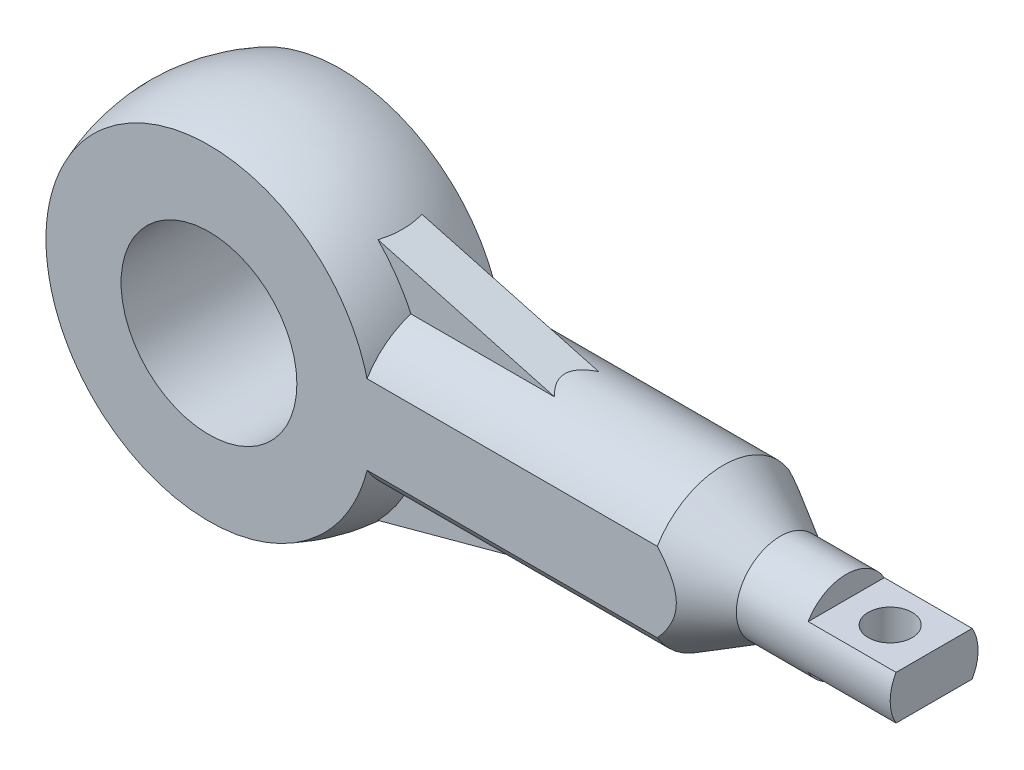
ISO-10303-21;
HEADER;
FILE_DESCRIPTION(('STEP AP214'),'2;1');
FILE_NAME('part.step','',(''),(''),'','','');
FILE_SCHEMA(('AUTOMOTIVE_DESIGN { 1 0 10303 214 1 1 1 1 }'));
ENDSEC;
DATA;
#1=APPLICATION_CONTEXT('core data for automotive mechanical design processes');
#2=APPLICATION_PROTOCOL_DEFINITION('international standard','automotive_design',2000,#1);
#3=PRODUCT_CONTEXT('',#1,'mechanical');
#4=PRODUCT('Part','Part','',(#3));
#5=PRODUCT_RELATED_PRODUCT_CATEGORY('part','',(#4));
#6=PRODUCT_DEFINITION_FORMATION('','',#4);
#7=PRODUCT_DEFINITION_CONTEXT('part definition',#1,'design');
#8=PRODUCT_DEFINITION('design','',#6,#7);
#9=PRODUCT_DEFINITION_SHAPE('','',#8);
#10=(LENGTH_UNIT() NAMED_UNIT(*) SI_UNIT(.MILLI.,.METRE.));
#11=(NAMED_UNIT(*) PLANE_ANGLE_UNIT() SI_UNIT($,.RADIAN.));
#12=(NAMED_UNIT(*) SI_UNIT($,.STERADIAN.) SOLID_ANGLE_UNIT());
#13=UNCERTAINTY_MEASURE_WITH_UNIT(LENGTH_MEASURE(1.E-05),#10,'distance_accuracy_value','');
#14=(GEOMETRIC_REPRESENTATION_CONTEXT(3) GLOBAL_UNCERTAINTY_ASSIGNED_CONTEXT((#13)) GLOBAL_UNIT_ASSIGNED_CONTEXT((#10,
#11,#12)) REPRESENTATION_CONTEXT('',''));
#15=CARTESIAN_POINT('',(0.,0.,0.));
#16=DIRECTION('',(0.,0.,1.));
#17=DIRECTION('',(1.,0.,0.));
#18=AXIS2_PLACEMENT_3D('',#15,#16,#17);
#19=CARTESIAN_POINT('',(150.,10.,0.));
#20=DIRECTION('',(-1.,0.,0.));
#21=DIRECTION('',(0.,0.,1.));
#22=AXIS2_PLACEMENT_3D('',#19,#20,#21);
#23=PLANE('',#22);
#24=DIRECTION('',(0.,0.,-1.));
#25=VECTOR('',#24,1.);
#26=CARTESIAN_POINT('',(150.,5.,15.001));
#27=LINE('',#26,#25);
#28=CARTESIAN_POINT('',(150.,5.,8.66025403784439));
#29=VERTEX_POINT('',#28);
#30=CARTESIAN_POINT('',(150.,5.,-8.66025403784439));
#31=VERTEX_POINT('',#30);
#32=EDGE_CURVE('E224',#29,#31,#27,.T.);
#33=ORIENTED_EDGE('',*,*,#32,.F.);
#34=CARTESIAN_POINT('',(150.,0.,0.));
#35=DIRECTION('',(-1.,0.,0.));
#36=DIRECTION('',(0.,0.,1.));
#37=AXIS2_PLACEMENT_3D('',#34,#35,#36);
#38=CIRCLE('',#37,10.);
#39=CARTESIAN_POINT('',(150.,-5.,8.66025403784439));
#40=VERTEX_POINT('',#39);
#41=EDGE_CURVE('E309',#40,#29,#38,.T.);
#42=ORIENTED_EDGE('',*,*,#41,.F.);
#43=DIRECTION('',(0.,0.,-1.));
#44=VECTOR('',#43,1.);
#45=CARTESIAN_POINT('',(150.,-5.,15.001));
#46=LINE('',#45,#44);
#47=CARTESIAN_POINT('',(150.,-5.,-8.66025403784439));
#48=VERTEX_POINT('',#47);
#49=EDGE_CURVE('E217',#40,#48,#46,.T.);
#50=ORIENTED_EDGE('',*,*,#49,.T.);
#51=EDGE_CURVE('E313',#31,#48,#38,.T.);
#52=ORIENTED_EDGE('',*,*,#51,.F.);
#53=EDGE_LOOP('',(#33,#42,#50,#52));
#54=FACE_BOUND('',#53,.T.);
#55=ADVANCED_FACE('F39',(#54),#23,.F.);
#56=CARTESIAN_POINT('',(0.,0.,0.));
#57=DIRECTION('',(-1.,0.,0.));
#58=DIRECTION('',(0.,0.,1.));
#59=AXIS2_PLACEMENT_3D('',#56,#57,#58);
#60=CYLINDRICAL_SURFACE('',#59,10.);
#61=CARTESIAN_POINT('',(115.,0.,0.));
#62=DIRECTION('',(-1.,0.,0.));
#63=DIRECTION('',(0.,0.,1.));
#64=AXIS2_PLACEMENT_3D('',#61,#62,#63);
#65=CIRCLE('',#64,10.);
#66=CARTESIAN_POINT('',(115.,0.,10.));
#67=VERTEX_POINT('',#66);
#68=EDGE_CURVE('E305',#67,#67,#65,.T.);
#69=ORIENTED_EDGE('',*,*,#68,.F.);
#70=EDGE_LOOP('',(#69));
#71=FACE_BOUND('',#70,.T.);
#72=CARTESIAN_POINT('',(130.,0.,0.));
#73=DIRECTION('',(1.,0.,0.));
#74=DIRECTION('',(0.,0.,-1.));
#75=AXIS2_PLACEMENT_3D('',#72,#73,#74);
#76=CIRCLE('',#75,10.);
#77=CARTESIAN_POINT('',(130.,5.,8.66025403784439));
#78=VERTEX_POINT('',#77);
#79=CARTESIAN_POINT('',(130.,5.,-8.66025403784439));
#80=VERTEX_POINT('',#79);
#81=EDGE_CURVE('E216',#78,#80,#76,.F.);
#82=ORIENTED_EDGE('',*,*,#81,.T.);
#83=DIRECTION('',(-1.,0.,0.));
#84=VECTOR('',#83,1.);
#85=CARTESIAN_POINT('',(0.,5.,-8.66025403784439));
#86=LINE('',#85,#84);
#87=EDGE_CURVE('E212',#31,#80,#86,.T.);
#88=ORIENTED_EDGE('',*,*,#87,.F.);
#89=ORIENTED_EDGE('',*,*,#51,.T.);
#90=DIRECTION('',(-1.,0.,0.));
#91=VECTOR('',#90,1.);
#92=CARTESIAN_POINT('',(0.,-5.,-8.66025403784439));
#93=LINE('',#92,#91);
#94=CARTESIAN_POINT('',(130.,-5.,-8.66025403784439));
#95=VERTEX_POINT('',#94);
#96=EDGE_CURVE('E208',#95,#48,#93,.F.);
#97=ORIENTED_EDGE('',*,*,#96,.F.);
#98=CARTESIAN_POINT('',(130.,0.,0.));
#99=DIRECTION('',(1.,0.,0.));
#100=DIRECTION('',(0.,0.,-1.));
#101=AXIS2_PLACEMENT_3D('',#98,#99,#100);
#102=CIRCLE('',#101,10.);
#103=CARTESIAN_POINT('',(130.,-5.,8.66025403784439));
#104=VERTEX_POINT('',#103);
#105=EDGE_CURVE('E234',#95,#104,#102,.F.);
#106=ORIENTED_EDGE('',*,*,#105,.T.);
#107=DIRECTION('',(-1.,0.,0.));
#108=VECTOR('',#107,1.);
#109=CARTESIAN_POINT('',(0.,-5.,8.66025403784439));
#110=LINE('',#109,#108);
#111=EDGE_CURVE('E237',#104,#40,#110,.F.);
#112=ORIENTED_EDGE('',*,*,#111,.T.);
#113=ORIENTED_EDGE('',*,*,#41,.T.);
#114=DIRECTION('',(-1.,0.,0.));
#115=VECTOR('',#114,1.);
#116=CARTESIAN_POINT('',(0.,5.,8.66025403784439));
#117=LINE('',#116,#115);
#118=EDGE_CURVE('E220',#29,#78,#117,.T.);
#119=ORIENTED_EDGE('',*,*,#118,.T.);
#120=EDGE_LOOP('',(#82,#88,#89,#97,#106,#112,#113,#119));
#121=FACE_BOUND('',#120,.T.);
#122=ADVANCED_FACE('F356',(#71,#121),#60,.T.);
#123=CARTESIAN_POINT('',(0.,0.,0.));
#124=DIRECTION('',(-1.,0.,0.));
#125=DIRECTION('',(0.,0.,1.));
#126=AXIS2_PLACEMENT_3D('',#123,#124,#125);
#127=CYLINDRICAL_SURFACE('',#126,17.5);
#128=CARTESIAN_POINT('',(102.009618943233,0.,0.));
#129=DIRECTION('',(-1.,0.,0.));
#130=DIRECTION('',(0.,0.,1.));
#131=AXIS2_PLACEMENT_3D('',#128,#129,#130);
#132=CIRCLE('',#131,17.5);
#133=CARTESIAN_POINT('',(102.009618943233,9.01387818865997,15.));
#134=VERTEX_POINT('',#133);
#135=CARTESIAN_POINT('',(102.009618943233,9.01387818865997,-15.));
#136=VERTEX_POINT('',#135);
#137=EDGE_CURVE('E302',#134,#136,#132,.T.);
#138=ORIENTED_EDGE('',*,*,#137,.T.);
#139=DIRECTION('',(-1.,0.,0.));
#140=VECTOR('',#139,1.);
#141=CARTESIAN_POINT('',(0.,9.01387818865997,-15.));
#142=LINE('',#141,#140);
#143=CARTESIAN_POINT('',(35.9687364248454,9.01387818865998,-15.));
#144=VERTEX_POINT('',#143);
#145=EDGE_CURVE('E11',#136,#144,#142,.T.);
#146=ORIENTED_EDGE('',*,*,#145,.T.);
#147=CARTESIAN_POINT('',(35.9687364248454,0.,0.));
#148=DIRECTION('',(-1.,0.,0.));
#149=DIRECTION('',(0.,0.,1.));
#150=AXIS2_PLACEMENT_3D('',#147,#148,#149);
#151=CIRCLE('',#150,17.5);
#152=CARTESIAN_POINT('',(35.9687364248454,16.7705098312484,-5.));
#153=VERTEX_POINT('',#152);
#154=EDGE_CURVE('E300',#153,#144,#151,.T.);
#155=ORIENTED_EDGE('',*,*,#154,.F.);
#156=DIRECTION('',(-1.,0.,0.));
#157=VECTOR('',#156,1.);
#158=CARTESIAN_POINT('',(0.,16.7705098312484,-5.));
#159=LINE('',#158,#157);
#160=CARTESIAN_POINT('',(68.6621134354366,16.7705098312484,-5.));
#161=VERTEX_POINT('',#160);
#162=EDGE_CURVE('E187',#161,#153,#159,.T.);
#163=ORIENTED_EDGE('',*,*,#162,.F.);
#164=CARTESIAN_POINT('',(130.581118749352,0.,0.));
#165=DIRECTION('',(-0.261426792553219,-0.965223306875324,0.));
#166=DIRECTION('',(-0.965223306875324,0.261426792553219,0.));
#167=AXIS2_PLACEMENT_3D('',#164,#165,#166);
#168=ELLIPSE('',#167,66.9403462020348,17.5);
#169=CARTESIAN_POINT('',(68.6621134354366,16.7705098312484,5.));
#170=VERTEX_POINT('',#169);
#171=EDGE_CURVE('E200',#161,#170,#168,.F.);
#172=ORIENTED_EDGE('',*,*,#171,.T.);
#173=DIRECTION('',(-1.,0.,0.));
#174=VECTOR('',#173,1.);
#175=CARTESIAN_POINT('',(0.,16.7705098312484,5.));
#176=LINE('',#175,#174);
#177=CARTESIAN_POINT('',(35.9687364248454,16.7705098312484,5.));
#178=VERTEX_POINT('',#177);
#179=EDGE_CURVE('E194',#170,#178,#176,.T.);
#180=ORIENTED_EDGE('',*,*,#179,.T.);
#181=CARTESIAN_POINT('',(35.9687364248454,9.01387818865997,15.));
#182=VERTEX_POINT('',#181);
#183=EDGE_CURVE('E295',#182,#178,#151,.T.);
#184=ORIENTED_EDGE('',*,*,#183,.F.);
#185=DIRECTION('',(-1.,0.,0.));
#186=VECTOR('',#185,1.);
#187=CARTESIAN_POINT('',(0.,9.01387818865997,15.));
#188=LINE('',#187,#186);
#189=EDGE_CURVE('E314',#182,#134,#188,.F.);
#190=ORIENTED_EDGE('',*,*,#189,.T.);
#191=EDGE_LOOP('',(#138,#146,#155,#163,#172,#180,#184,#190));
#192=FACE_BOUND('',#191,.T.);
#193=ADVANCED_FACE('F339',(#192),#127,.T.);
#194=CARTESIAN_POINT('',(0.,0.,0.));
#195=DIRECTION('',(-1.,0.,0.));
#196=DIRECTION('',(0.,1.,0.));
#197=AXIS2_PLACEMENT_3D('',#194,#195,#196);
#198=SPHERICAL_SURFACE('',#197,40.);
#199=CARTESIAN_POINT('',(8.92443178353758,-32.9502170529664,0.));
#200=DIRECTION('',(0.261426792553219,-0.965223306875324,0.));
#201=DIRECTION('',(0.965223306875324,0.261426792553219,0.));
#202=AXIS2_PLACEMENT_3D('',#199,#200,#201);
#203=CIRCLE('',#202,20.8479666515318);
#204=CARTESIAN_POINT('',(28.4600773263794,-27.6590672036587,-5.));
#205=VERTEX_POINT('',#204);
#206=CARTESIAN_POINT('',(28.4600773263794,-27.6590672036587,5.));
#207=VERTEX_POINT('',#206);
#208=EDGE_CURVE('E55',#205,#207,#203,.T.);
#209=ORIENTED_EDGE('',*,*,#208,.T.);
#210=CARTESIAN_POINT('',(0.,0.,5.));
#211=DIRECTION('',(0.,0.,1.));
#212=DIRECTION('',(1.,0.,0.));
#213=AXIS2_PLACEMENT_3D('',#210,#211,#212);
#214=CIRCLE('',#213,39.6862696659689);
#215=CARTESIAN_POINT('',(35.9687364248454,-16.7705098312484,5.));
#216=VERTEX_POINT('',#215);
#217=EDGE_CURVE('E152',#207,#216,#214,.T.);
#218=ORIENTED_EDGE('',*,*,#217,.T.);
#219=CARTESIAN_POINT('',(35.9687364248454,-9.01387818865998,15.));
#220=VERTEX_POINT('',#219);
#221=EDGE_CURVE('E294',#216,#220,#151,.T.);
#222=ORIENTED_EDGE('',*,*,#221,.T.);
#223=CARTESIAN_POINT('',(0.,0.,15.));
#224=DIRECTION('',(0.,0.,-1.));
#225=DIRECTION('',(-1.,0.,0.));
#226=AXIS2_PLACEMENT_3D('',#223,#224,#225);
#227=CIRCLE('',#226,37.0809924354783);
#228=EDGE_CURVE('E290',#220,#182,#227,.T.);
#229=ORIENTED_EDGE('',*,*,#228,.T.);
#230=ORIENTED_EDGE('',*,*,#183,.T.);
#231=CARTESIAN_POINT('',(0.,0.,5.));
#232=DIRECTION('',(0.,0.,1.));
#233=DIRECTION('',(1.,0.,0.));
#234=AXIS2_PLACEMENT_3D('',#231,#232,#233);
#235=CIRCLE('',#234,39.6862696659689);
#236=CARTESIAN_POINT('',(28.4600773263794,27.6590672036587,5.));
#237=VERTEX_POINT('',#236);
#238=EDGE_CURVE('E191',#178,#237,#235,.T.);
#239=ORIENTED_EDGE('',*,*,#238,.T.);
#240=CARTESIAN_POINT('',(8.92443178353758,32.9502170529664,0.));
#241=DIRECTION('',(-0.261426792553219,-0.965223306875324,0.));
#242=DIRECTION('',(0.965223306875324,-0.261426792553219,0.));
#243=AXIS2_PLACEMENT_3D('',#240,#241,#242);
#244=CIRCLE('',#243,20.8479666515318);
#245=CARTESIAN_POINT('',(28.4600773263794,27.6590672036587,-5.));
#246=VERTEX_POINT('',#245);
#247=EDGE_CURVE('E197',#237,#246,#244,.F.);
#248=ORIENTED_EDGE('',*,*,#247,.T.);
#249=CARTESIAN_POINT('',(0.,0.,-5.));
#250=DIRECTION('',(0.,0.,1.));
#251=DIRECTION('',(1.,0.,0.));
#252=AXIS2_PLACEMENT_3D('',#249,#250,#251);
#253=CIRCLE('',#252,39.6862696659689);
#254=EDGE_CURVE('E180',#153,#246,#253,.T.);
#255=ORIENTED_EDGE('',*,*,#254,.F.);
#256=ORIENTED_EDGE('',*,*,#154,.T.);
#257=CARTESIAN_POINT('',(0.,0.,-15.));
#258=DIRECTION('',(0.,0.,1.));
#259=DIRECTION('',(1.,0.,0.));
#260=AXIS2_PLACEMENT_3D('',#257,#258,#259);
#261=CIRCLE('',#260,37.0809924354783);
#262=CARTESIAN_POINT('',(35.9687364248454,-9.01387818865997,-15.));
#263=VERTEX_POINT('',#262);
#264=EDGE_CURVE('E264',#144,#263,#261,.T.);
#265=ORIENTED_EDGE('',*,*,#264,.T.);
#266=CARTESIAN_POINT('',(35.9687364248454,-16.7705098312484,-5.));
#267=VERTEX_POINT('',#266);
#268=EDGE_CURVE('E301',#263,#267,#151,.T.);
#269=ORIENTED_EDGE('',*,*,#268,.T.);
#270=CARTESIAN_POINT('',(0.,0.,-5.));
#271=DIRECTION('',(0.,0.,1.));
#272=DIRECTION('',(1.,0.,0.));
#273=AXIS2_PLACEMENT_3D('',#270,#271,#272);
#274=CIRCLE('',#273,39.6862696659689);
#275=EDGE_CURVE('E60',#205,#267,#274,.T.);
#276=ORIENTED_EDGE('',*,*,#275,.F.);
#277=EDGE_LOOP('',(#209,#218,#222,#229,#230,#239,#248,#255,#256,#265,#269,#276));
#278=FACE_BOUND('',#277,.T.);
#279=ADVANCED_FACE('F41',(#278),#198,.T.);
#280=CARTESIAN_POINT('',(115.,0.,0.));
#281=DIRECTION('',(-1.,0.,0.));
#282=DIRECTION('',(0.,0.,1.));
#283=AXIS2_PLACEMENT_3D('',#280,#281,#282);
#284=CONICAL_SURFACE('',#283,10.,0.523598775598299);
#285=CARTESIAN_POINT('',(64.6764576355632,-36.058829524109,-15.));
#286=CARTESIAN_POINT('',(65.682124961538,-35.4299390690583,-15.));
#287=CARTESIAN_POINT('',(66.6867341701834,-34.7993500219524,-15.));
#288=CARTESIAN_POINT('',(68.6933968407581,-33.5340884189301,-15.));
#289=CARTESIAN_POINT('',(69.6954502666173,-32.899415805822,-15.));
#290=CARTESIAN_POINT('',(71.697032877283,-31.6250004724211,-15.));
#291=CARTESIAN_POINT('',(72.6965605529674,-30.9852553801618,-15.));
#292=CARTESIAN_POINT('',(74.6919752984112,-29.7001193997222,-15.));
#293=CARTESIAN_POINT('',(75.6878623863205,-29.054728539743,-15.));
#294=CARTESIAN_POINT('',(77.6889287967543,-27.7482285840244,-15.));
#295=CARTESIAN_POINT('',(78.6940467947147,-27.0870254734471,-15.));
#296=CARTESIAN_POINT('',(80.6986640191708,-25.7561569201325,-15.));
#297=CARTESIAN_POINT('',(81.6981632791229,-25.0864915278607,-15.));
#298=CARTESIAN_POINT('',(83.6898556294696,-23.7368548740184,-15.));
#299=CARTESIAN_POINT('',(84.6820503334358,-23.0568859965688,-15.));
#300=CARTESIAN_POINT('',(86.6573210938738,-21.6838370953018,-15.));
#301=CARTESIAN_POINT('',(87.6403973866783,-20.9907574127156,-15.));
#302=CARTESIAN_POINT('',(89.1044651003762,-19.9395356282845,-15.));
#303=CARTESIAN_POINT('',(89.590009053093,-19.5877312944088,-15.));
#304=CARTESIAN_POINT('',(90.5575726907277,-18.8793128602188,-15.));
#305=CARTESIAN_POINT('',(91.0395924102056,-18.5226988071685,-15.));
#306=CARTESIAN_POINT('',(91.9996215965473,-17.8038484792425,-15.));
#307=CARTESIAN_POINT('',(92.4776299874748,-17.4416107658208,-15.));
#308=CARTESIAN_POINT('',(93.4287250790402,-16.7107286179595,-15.));
#309=CARTESIAN_POINT('',(93.9018118181284,-16.3420842336322,-15.));
#310=CARTESIAN_POINT('',(94.8401987396026,-15.5987937165396,-15.));
#311=CARTESIAN_POINT('',(95.3055224085255,-15.2241772878236,-15.));
#312=CARTESIAN_POINT('',(96.2290354156052,-14.4661929196328,-15.));
#313=CARTESIAN_POINT('',(96.6872244694631,-14.082824632909,-15.));
#314=CARTESIAN_POINT('',(97.5945512724964,-13.3058756585441,-15.));
#315=CARTESIAN_POINT('',(98.0436927266393,-12.9122993085885,-15.));
#316=CARTESIAN_POINT('',(98.9307799468095,-12.1127621719422,-15.));
#317=CARTESIAN_POINT('',(99.3687269992132,-11.7068028200789,-15.));
#318=CARTESIAN_POINT('',(100.112074553379,-10.9932592484842,-15.));
#319=CARTESIAN_POINT('',(100.420884583103,-10.6892314319921,-15.));
#320=CARTESIAN_POINT('',(101.029253919154,-10.0720066345793,-15.));
#321=CARTESIAN_POINT('',(101.32881298213,-9.75880941287364,-15.));
#322=CARTESIAN_POINT('',(101.917391662358,-9.12083467288816,-15.));
#323=CARTESIAN_POINT('',(102.206376101068,-8.79602455562942,-15.));
#324=CARTESIAN_POINT('',(102.76989513439,-8.13404520149835,-15.));
#325=CARTESIAN_POINT('',(103.04443004807,-7.79687623780824,-15.));
#326=CARTESIAN_POINT('',(103.578655184122,-7.10368708717479,-15.));
#327=CARTESIAN_POINT('',(103.838099315199,-6.74747577865695,-15.));
#328=CARTESIAN_POINT('',(104.332673594474,-6.01821224418128,-15.));
#329=CARTESIAN_POINT('',(104.567796043434,-5.64515473877516,-15.));
#330=CARTESIAN_POINT('',(105.005232901857,-4.88232077792489,-15.));
#331=CARTESIAN_POINT('',(105.207691504423,-4.49262797538464,-15.));
#332=CARTESIAN_POINT('',(105.57155655906,-3.69455845090558,-15.));
#333=CARTESIAN_POINT('',(105.733007122672,-3.28620236760122,-15.));
#334=CARTESIAN_POINT('',(105.948718258365,-2.62340629501984,-15.));
#335=CARTESIAN_POINT('',(106.019801026837,-2.37440360222564,-15.));
#336=CARTESIAN_POINT('',(106.141859388754,-1.87148768633617,-15.));
#337=CARTESIAN_POINT('',(106.192837835697,-1.61757516548577,-15.));
#338=CARTESIAN_POINT('',(106.272873937252,-1.106538588957,-15.));
#339=CARTESIAN_POINT('',(106.301952511518,-0.849417837254382,-15.));
#340=CARTESIAN_POINT('',(106.33715476653,-0.333590541251407,-15.));
#341=CARTESIAN_POINT('',(106.343278358275,-0.0748839908064155,-15.));
#342=CARTESIAN_POINT('',(106.332315118109,0.442377384005598,-15.));
#343=CARTESIAN_POINT('',(106.31519728075,0.700931544432368,-15.));
#344=CARTESIAN_POINT('',(106.258378304805,1.2155206532772,-15.));
#345=CARTESIAN_POINT('',(106.218677004026,1.47155558358883,-15.));
#346=CARTESIAN_POINT('',(106.118122080025,1.97958545982624,-15.));
#347=CARTESIAN_POINT('',(106.057253779467,2.23157747519804,-15.));
#348=CARTESIAN_POINT('',(105.916359233805,2.73012093555807,-15.));
#349=CARTESIAN_POINT('',(105.836330269147,2.97667160280228,-15.));
#350=CARTESIAN_POINT('',(105.613392909342,3.58989347460865,-15.));
#351=CARTESIAN_POINT('',(105.459399418976,3.95254559596395,-15.));
#352=CARTESIAN_POINT('',(105.119888287151,4.66276023148506,-15.));
#353=CARTESIAN_POINT('',(104.934350443417,5.01031289512388,-15.));
#354=CARTESIAN_POINT('',(104.537582675984,5.69214363828478,-15.));
#355=CARTESIAN_POINT('',(104.326254916434,6.02636435800243,-15.));
#356=CARTESIAN_POINT('',(103.994471985659,6.51747184585224,-15.));
#357=CARTESIAN_POINT('',(103.881428532679,6.67944947515229,-15.));
#358=CARTESIAN_POINT('',(103.650915387025,7.0002245473228,-15.));
#359=CARTESIAN_POINT('',(103.533445754208,7.159022033156,-15.));
#360=CARTESIAN_POINT('',(103.178854429021,7.62602309044351,-15.));
#361=CARTESIAN_POINT('',(102.936065179852,7.92993186812791,-15.));
#362=CARTESIAN_POINT('',(102.438204753792,8.52756092626357,-15.));
#363=CARTESIAN_POINT('',(102.18313066559,8.82127876296959,-15.));
#364=CARTESIAN_POINT('',(101.662787474502,9.39999033195982,-15.));
#365=CARTESIAN_POINT('',(101.397509411829,9.68497598330298,-15.));
#366=CARTESIAN_POINT('',(100.858770322552,10.2470362736412,-15.));
#367=CARTESIAN_POINT('',(100.585309914042,10.5241115071137,-15.));
#368=CARTESIAN_POINT('',(100.030606836286,11.0722875359114,-15.));
#369=CARTESIAN_POINT('',(99.7493405006461,11.3433643245137,-15.));
#370=CARTESIAN_POINT('',(99.1810310854785,11.8793889516971,-15.));
#371=CARTESIAN_POINT('',(98.8939879144494,12.1443366930553,-15.));
#372=CARTESIAN_POINT('',(98.3151400032922,12.6686944993651,-15.));
#373=CARTESIAN_POINT('',(98.0233375574246,12.9281071010493,-15.));
#374=CARTESIAN_POINT('',(97.4355336693643,13.4421360804964,-15.));
#375=CARTESIAN_POINT('',(97.1395321218576,13.696752337592,-15.));
#376=CARTESIAN_POINT('',(96.2387473801894,14.4604639017932,-15.));
#377=CARTESIAN_POINT('',(95.6283692499135,14.9629661693304,-15.));
#378=CARTESIAN_POINT('',(94.3963863358104,15.9540536352016,-15.));
#379=CARTESIAN_POINT('',(93.7747805178952,16.4426375408418,-15.));
#380=CARTESIAN_POINT('',(92.5241542930287,17.4074324277444,-15.));
#381=CARTESIAN_POINT('',(91.8951523621908,17.883667406226,-15.));
#382=CARTESIAN_POINT('',(90.6302010586126,18.8268309365509,-15.));
#383=CARTESIAN_POINT('',(89.9942515217081,19.2937592677489,-15.));
#384=CARTESIAN_POINT('',(88.8463960846147,20.1258341635171,-15.));
#385=CARTESIAN_POINT('',(88.3355171108849,20.4924001617977,-15.));
#386=CARTESIAN_POINT('',(87.3106862535526,21.2212135351825,-15.));
#387=CARTESIAN_POINT('',(86.7967343537147,21.583460887439,-15.));
#388=CARTESIAN_POINT('',(85.2508937783847,22.6645559245218,-15.));
#389=CARTESIAN_POINT('',(84.2150429823232,23.3777401738577,-15.));
#390=CARTESIAN_POINT('',(82.1344149299577,24.7928954857448,-15.));
#391=CARTESIAN_POINT('',(81.0896306875603,25.4948562458313,-15.));
#392=CARTESIAN_POINT('',(78.9937519253787,26.8892976279201,-15.));
#393=CARTESIAN_POINT('',(77.9426573660436,27.5817781904143,-15.));
#394=CARTESIAN_POINT('',(75.8780388583375,28.9311815156158,-15.));
#395=CARTESIAN_POINT('',(74.8647143549297,29.5884098233483,-15.));
#396=CARTESIAN_POINT('',(72.8342568315677,30.896965490565,-15.));
#397=CARTESIAN_POINT('',(71.8171237902929,31.5482928169452,-15.));
#398=CARTESIAN_POINT('',(69.7809062812839,32.8452276199072,-15.));
#399=CARTESIAN_POINT('',(68.7618255308859,33.4908409374627,-15.));
#400=CARTESIAN_POINT('',(66.7210134666199,34.7778310527241,-15.));
#401=CARTESIAN_POINT('',(65.6992821935066,35.4192079150385,-15.));
#402=CARTESIAN_POINT('',(64.6764576355632,36.0588295241089,-15.));
#403=B_SPLINE_CURVE_WITH_KNOTS('',3,(#285,#286,#287,#288,#289,#290,#291,#292,#293,#294,#295,
#296,#297,#298,#299,#300,#301,#302,#303,#304,#305,#306,#307,#308,#309,#310,#311,#312,#313,#314,
#315,#316,#317,#318,#319,#320,#321,#322,#323,#324,#325,#326,#327,#328,#329,#330,#331,#332,#333,
#334,#335,#336,#337,#338,#339,#340,#341,#342,#343,#344,#345,#346,#347,#348,#349,#350,#351,#352,
#353,#354,#355,#356,#357,#358,#359,#360,#361,#362,#363,#364,#365,#366,#367,#368,#369,#370,#371,
#372,#373,#374,#375,#376,#377,#378,#379,#380,#381,#382,#383,#384,#385,#386,#387,#388,#389,#390,
#391,#392,#393,#394,#395,#396,#397,#398,#399,#400,#401,#402),.UNSPECIFIED.,.F.,.F.,(4,2,2,2,2,2,
2,2,2,2,2,2,2,2,2,2,2,2,2,2,2,2,2,2,2,2,2,2,2,2,2,2,2,2,2,2,2,2,2,2,2,2,2,2,2,2,2,2,2,2,2,2,2,2,
2,2,2,2,4),(0.,3.55834997637371,7.11674989760774,10.6769254743079,14.2370832778343,
17.8463518158245,21.4555988397901,25.0640231013802,28.6723535763678,30.4711277035331,
32.2698841674333,34.06910859767,35.8683189609112,37.6603729741897,39.4524982151272,
41.2438740213107,43.0350430421069,44.3349502812289,45.6348916860603,46.9388238195963,
48.2427271481348,49.5639779494999,50.8856457324169,52.2013092287875,53.5155514404247,
54.2916944464156,55.0677272512139,55.8430178141993,56.6183113831743,57.3946402567567,
58.1709747059704,58.9478485475426,59.7248327195569,60.9047883159786,62.0855024699753,
63.270843754217,63.8633562714108,64.4558607785394,65.6223698274045,66.7891566937558,
67.9569925756661,69.1247404610275,70.2965314369959,71.4683409879335,72.6396014385814,
73.8108913167159,76.1824373472926,78.5542029262185,80.9209489920695,83.2877511029794,
85.1740757974404,87.0604104669855,90.8331639724604,94.6092019493785,98.3852636179667,
102.008633518969,105.63202373425,109.251139683917,112.870200311813),.UNSPECIFIED.);
#404=CARTESIAN_POINT('',(102.009618943233,-9.01387818865997,-15.));
#405=VERTEX_POINT('',#404);
#406=EDGE_CURVE('E254',#405,#136,#403,.T.);
#407=ORIENTED_EDGE('',*,*,#406,.T.);
#408=ORIENTED_EDGE('',*,*,#137,.F.);
#409=CARTESIAN_POINT('',(64.6764576355632,36.0588295241089,15.));
#410=CARTESIAN_POINT('',(65.682124961538,35.4299390690583,15.));
#411=CARTESIAN_POINT('',(66.6867341701834,34.7993500219524,15.));
#412=CARTESIAN_POINT('',(68.6933968407581,33.5340884189302,15.));
#413=CARTESIAN_POINT('',(69.6954502666172,32.899415805822,15.));
#414=CARTESIAN_POINT('',(71.697032877283,31.6250004724212,15.));
#415=CARTESIAN_POINT('',(72.6965605529673,30.9852553801618,15.));
#416=CARTESIAN_POINT('',(74.6919752984111,29.7001193997222,15.));
#417=CARTESIAN_POINT('',(75.6878623863204,29.054728539743,15.));
#418=CARTESIAN_POINT('',(77.6889287967542,27.7482285840245,15.));
#419=CARTESIAN_POINT('',(78.6940467947147,27.0870254734471,15.));
#420=CARTESIAN_POINT('',(80.6986640191707,25.7561569201325,15.));
#421=CARTESIAN_POINT('',(81.6981632791229,25.0864915278608,15.));
#422=CARTESIAN_POINT('',(83.6898556294695,23.7368548740184,15.));
#423=CARTESIAN_POINT('',(84.6820503334357,23.0568859965688,15.));
#424=CARTESIAN_POINT('',(86.6573210938737,21.6838370953018,15.));
#425=CARTESIAN_POINT('',(87.6403973866782,20.9907574127157,15.));
#426=CARTESIAN_POINT('',(89.1044651003761,19.9395356282846,15.));
#427=CARTESIAN_POINT('',(89.5900090530929,19.5877312944089,15.));
#428=CARTESIAN_POINT('',(90.5575726907276,18.8793128602189,15.));
#429=CARTESIAN_POINT('',(91.0395924102055,18.5226988071686,15.));
#430=CARTESIAN_POINT('',(91.9996215965472,17.8038484792426,15.));
#431=CARTESIAN_POINT('',(92.4776299874747,17.4416107658208,15.));
#432=CARTESIAN_POINT('',(93.4287250790401,16.7107286179596,15.));
#433=CARTESIAN_POINT('',(93.9018118181283,16.3420842336323,15.));
#434=CARTESIAN_POINT('',(94.8401987396025,15.5987937165397,15.));
#435=CARTESIAN_POINT('',(95.3055224085253,15.2241772878237,15.));
#436=CARTESIAN_POINT('',(96.229035415605,14.4661929196329,15.));
#437=CARTESIAN_POINT('',(96.6872244694629,14.0828246329092,15.));
#438=CARTESIAN_POINT('',(97.5945512724963,13.3058756585442,15.));
#439=CARTESIAN_POINT('',(98.0436927266392,12.9122993085886,15.));
#440=CARTESIAN_POINT('',(98.9307799468094,12.1127621719423,15.));
#441=CARTESIAN_POINT('',(99.3687269992131,11.706802820079,15.));
#442=CARTESIAN_POINT('',(100.112074553378,10.9932592484843,15.));
#443=CARTESIAN_POINT('',(100.420884583102,10.6892314319922,15.));
#444=CARTESIAN_POINT('',(101.029253919154,10.0720066345794,15.));
#445=CARTESIAN_POINT('',(101.32881298213,9.75880941287375,15.));
#446=CARTESIAN_POINT('',(101.917391662358,9.12083467288826,15.));
#447=CARTESIAN_POINT('',(102.206376101068,8.79602455562953,15.));
#448=CARTESIAN_POINT('',(102.76989513439,8.13404520149845,15.));
#449=CARTESIAN_POINT('',(103.04443004807,7.79687623780834,15.));
#450=CARTESIAN_POINT('',(103.578655184122,7.10368708717489,15.));
#451=CARTESIAN_POINT('',(103.838099315199,6.74747577865705,15.));
#452=CARTESIAN_POINT('',(104.332673594474,6.01821224418137,15.));
#453=CARTESIAN_POINT('',(104.567796043434,5.64515473877523,15.));
#454=CARTESIAN_POINT('',(105.005232901857,4.88232077792496,15.));
#455=CARTESIAN_POINT('',(105.207691504423,4.49262797538472,15.));
#456=CARTESIAN_POINT('',(105.57155655906,3.69455845090564,15.));
#457=CARTESIAN_POINT('',(105.733007122672,3.28620236760127,15.));
#458=CARTESIAN_POINT('',(105.948718258365,2.62340629501989,15.));
#459=CARTESIAN_POINT('',(106.019801026837,2.37440360222568,15.));
#460=CARTESIAN_POINT('',(106.141859388754,1.87148768633621,15.));
#461=CARTESIAN_POINT('',(106.192837835697,1.61757516548581,15.));
#462=CARTESIAN_POINT('',(106.272873937252,1.10653858895704,15.));
#463=CARTESIAN_POINT('',(106.301952511518,0.849417837254422,15.));
#464=CARTESIAN_POINT('',(106.33715476653,0.333590541251447,15.));
#465=CARTESIAN_POINT('',(106.343278358275,0.0748839908064569,15.));
#466=CARTESIAN_POINT('',(106.332315118109,-0.442377384005557,15.));
#467=CARTESIAN_POINT('',(106.31519728075,-0.700931544432327,15.));
#468=CARTESIAN_POINT('',(106.258378304805,-1.21552065327716,15.));
#469=CARTESIAN_POINT('',(106.218677004026,-1.47155558358878,15.));
#470=CARTESIAN_POINT('',(106.118122080025,-1.97958545982619,15.));
#471=CARTESIAN_POINT('',(106.057253779467,-2.231577475198,15.));
#472=CARTESIAN_POINT('',(105.916359233805,-2.73012093555804,15.));
#473=CARTESIAN_POINT('',(105.836330269147,-2.97667160280225,15.));
#474=CARTESIAN_POINT('',(105.613392909343,-3.58989347460861,15.));
#475=CARTESIAN_POINT('',(105.459399418976,-3.95254559596391,15.));
#476=CARTESIAN_POINT('',(105.119888287151,-4.66276023148501,15.));
#477=CARTESIAN_POINT('',(104.934350443417,-5.01031289512382,15.));
#478=CARTESIAN_POINT('',(104.537582675984,-5.69214363828472,15.));
#479=CARTESIAN_POINT('',(104.326254916434,-6.02636435800237,15.));
#480=CARTESIAN_POINT('',(103.994471985659,-6.51747184585218,15.));
#481=CARTESIAN_POINT('',(103.881428532679,-6.67944947515223,15.));
#482=CARTESIAN_POINT('',(103.650915387025,-7.00022454732274,15.));
#483=CARTESIAN_POINT('',(103.533445754208,-7.15902203315594,15.));
#484=CARTESIAN_POINT('',(103.178854429021,-7.62602309044346,15.));
#485=CARTESIAN_POINT('',(102.936065179852,-7.92993186812785,15.));
#486=CARTESIAN_POINT('',(102.438204753792,-8.5275609262635,15.));
#487=CARTESIAN_POINT('',(102.18313066559,-8.82127876296951,15.));
#488=CARTESIAN_POINT('',(101.662787474502,-9.39999033195973,15.));
#489=CARTESIAN_POINT('',(101.397509411829,-9.68497598330289,15.));
#490=CARTESIAN_POINT('',(100.858770322552,-10.2470362736411,15.));
#491=CARTESIAN_POINT('',(100.585309914042,-10.5241115071136,15.));
#492=CARTESIAN_POINT('',(100.030606836286,-11.0722875359113,15.));
#493=CARTESIAN_POINT('',(99.7493405006462,-11.3433643245136,15.));
#494=CARTESIAN_POINT('',(99.1810310854786,-11.879388951697,15.));
#495=CARTESIAN_POINT('',(98.8939879144495,-12.1443366930552,15.));
#496=CARTESIAN_POINT('',(98.3151400032924,-12.668694499365,15.));
#497=CARTESIAN_POINT('',(98.0233375574248,-12.9281071010492,15.));
#498=CARTESIAN_POINT('',(97.4355336693645,-13.4421360804962,15.));
#499=CARTESIAN_POINT('',(97.1395321218578,-13.6967523375919,15.));
#500=CARTESIAN_POINT('',(96.2387473801896,-14.460463901793,15.));
#501=CARTESIAN_POINT('',(95.6283692499137,-14.9629661693302,15.));
#502=CARTESIAN_POINT('',(94.3963863358107,-15.9540536352014,15.));
#503=CARTESIAN_POINT('',(93.7747805178955,-16.4426375408416,15.));
#504=CARTESIAN_POINT('',(92.524154293029,-17.4074324277443,15.));
#505=CARTESIAN_POINT('',(91.8951523621911,-17.8836674062258,15.));
#506=CARTESIAN_POINT('',(90.6302010586128,-18.8268309365507,15.));
#507=CARTESIAN_POINT('',(89.9942515217084,-19.2937592677487,15.));
#508=CARTESIAN_POINT('',(88.846396084615,-20.1258341635169,15.));
#509=CARTESIAN_POINT('',(88.3355171108851,-20.4924001617975,15.));
#510=CARTESIAN_POINT('',(87.3106862535529,-21.2212135351823,15.));
#511=CARTESIAN_POINT('',(86.796734353715,-21.5834608874388,15.));
#512=CARTESIAN_POINT('',(85.2508937783849,-22.6645559245216,15.));
#513=CARTESIAN_POINT('',(84.2150429823235,-23.3777401738575,15.));
#514=CARTESIAN_POINT('',(82.1344149299579,-24.7928954857446,15.));
#515=CARTESIAN_POINT('',(81.0896306875605,-25.4948562458312,15.));
#516=CARTESIAN_POINT('',(78.9937519253789,-26.88929762792,15.));
#517=CARTESIAN_POINT('',(77.9426573660437,-27.5817781904142,15.));
#518=CARTESIAN_POINT('',(75.8780388583376,-28.9311815156157,15.));
#519=CARTESIAN_POINT('',(74.8647143549299,-29.5884098233482,15.));
#520=CARTESIAN_POINT('',(72.8342568315678,-30.8969654905649,15.));
#521=CARTESIAN_POINT('',(71.817123790293,-31.5482928169451,15.));
#522=CARTESIAN_POINT('',(69.780906281284,-32.8452276199072,15.));
#523=CARTESIAN_POINT('',(68.761825530886,-33.4908409374627,15.));
#524=CARTESIAN_POINT('',(66.72101346662,-34.7778310527241,15.));
#525=CARTESIAN_POINT('',(65.6992821935066,-35.4192079150385,15.));
#526=CARTESIAN_POINT('',(64.6764576355632,-36.0588295241089,15.));
#527=B_SPLINE_CURVE_WITH_KNOTS('',3,(#409,#410,#411,#412,#413,#414,#415,#416,#417,#418,#419,
#420,#421,#422,#423,#424,#425,#426,#427,#428,#429,#430,#431,#432,#433,#434,#435,#436,#437,#438,
#439,#440,#441,#442,#443,#444,#445,#446,#447,#448,#449,#450,#451,#452,#453,#454,#455,#456,#457,
#458,#459,#460,#461,#462,#463,#464,#465,#466,#467,#468,#469,#470,#471,#472,#473,#474,#475,#476,
#477,#478,#479,#480,#481,#482,#483,#484,#485,#486,#487,#488,#489,#490,#491,#492,#493,#494,#495,
#496,#497,#498,#499,#500,#501,#502,#503,#504,#505,#506,#507,#508,#509,#510,#511,#512,#513,#514,
#515,#516,#517,#518,#519,#520,#521,#522,#523,#524,#525,#526),.UNSPECIFIED.,.F.,.F.,(4,2,2,2,2,2,
2,2,2,2,2,2,2,2,2,2,2,2,2,2,2,2,2,2,2,2,2,2,2,2,2,2,2,2,2,2,2,2,2,2,2,2,2,2,2,2,2,2,2,2,2,2,2,2,
2,2,2,2,4),(0.,3.5583499763737,7.11674989760771,10.6769254743078,14.2370832778343,
17.8463518158244,21.45559883979,25.0640231013801,28.6723535763677,30.4711277035329,
32.2698841674332,34.0691085976699,35.868318960911,37.6603729741895,39.452498215127,
41.2438740213105,43.0350430421067,44.3349502812287,45.6348916860602,46.9388238195961,
48.2427271481347,49.5639779494998,50.8856457324168,52.2013092287874,53.5155514404246,
54.2916944464155,55.0677272512139,55.8430178141993,56.6183113831743,57.3946402567566,
58.1709747059703,58.9478485475426,59.7248327195569,60.9047883159785,62.0855024699752,
63.2708437542169,63.8633562714107,64.4558607785393,65.6223698274043,66.7891566937557,
67.956992575666,69.1247404610273,70.2965314369957,71.4683409879333,72.6396014385811,
73.8108913167157,76.1824373472923,78.5542029262181,80.9209489920692,83.287751102979,
85.17407579744,87.0604104669851,90.8331639724601,94.6092019493782,98.3852636179665,
102.008633518969,105.632023734249,109.251139683917,112.870200311813),.UNSPECIFIED.);
#528=CARTESIAN_POINT('',(102.009618943233,-9.01387818865997,15.));
#529=VERTEX_POINT('',#528);
#530=EDGE_CURVE('E282',#134,#529,#527,.T.);
#531=ORIENTED_EDGE('',*,*,#530,.T.);
#532=EDGE_CURVE('E299',#405,#529,#132,.T.);
#533=ORIENTED_EDGE('',*,*,#532,.F.);
#534=EDGE_LOOP('',(#407,#408,#531,#533));
#535=FACE_BOUND('',#534,.T.);
#536=ORIENTED_EDGE('',*,*,#68,.T.);
#537=EDGE_LOOP('',(#536));
#538=FACE_BOUND('',#537,.T.);
#539=ADVANCED_FACE('F266',(#535,#538),#284,.T.);
#540=ORIENTED_EDGE('',*,*,#221,.F.);
#541=DIRECTION('',(-1.,0.,0.));
#542=VECTOR('',#541,1.);
#543=CARTESIAN_POINT('',(0.,-16.7705098312484,5.));
#544=LINE('',#543,#542);
#545=CARTESIAN_POINT('',(68.6621134354366,-16.7705098312484,5.));
#546=VERTEX_POINT('',#545);
#547=EDGE_CURVE('E146',#216,#546,#544,.F.);
#548=ORIENTED_EDGE('',*,*,#547,.T.);
#549=CARTESIAN_POINT('',(130.581118749352,0.,0.));
#550=DIRECTION('',(0.261426792553219,-0.965223306875324,0.));
#551=DIRECTION('',(-0.965223306875324,-0.261426792553219,0.));
#552=AXIS2_PLACEMENT_3D('',#549,#550,#551);
#553=ELLIPSE('',#552,66.9403462020348,17.5);
#554=CARTESIAN_POINT('',(68.6621134354366,-16.7705098312484,-5.));
#555=VERTEX_POINT('',#554);
#556=EDGE_CURVE('E139',#546,#555,#553,.T.);
#557=ORIENTED_EDGE('',*,*,#556,.T.);
#558=DIRECTION('',(-1.,0.,0.));
#559=VECTOR('',#558,1.);
#560=CARTESIAN_POINT('',(0.,-16.7705098312484,-5.));
#561=LINE('',#560,#559);
#562=EDGE_CURVE('E144',#267,#555,#561,.F.);
#563=ORIENTED_EDGE('',*,*,#562,.F.);
#564=ORIENTED_EDGE('',*,*,#268,.F.);
#565=DIRECTION('',(-1.,0.,0.));
#566=VECTOR('',#565,1.);
#567=CARTESIAN_POINT('',(0.,-9.01387818865997,-15.));
#568=LINE('',#567,#566);
#569=EDGE_CURVE('E48',#263,#405,#568,.F.);
#570=ORIENTED_EDGE('',*,*,#569,.T.);
#571=ORIENTED_EDGE('',*,*,#532,.T.);
#572=DIRECTION('',(-1.,0.,0.));
#573=VECTOR('',#572,1.);
#574=CARTESIAN_POINT('',(0.,-9.01387818865997,15.));
#575=LINE('',#574,#573);
#576=EDGE_CURVE('E318',#529,#220,#575,.T.);
#577=ORIENTED_EDGE('',*,*,#576,.T.);
#578=EDGE_LOOP('',(#540,#548,#557,#563,#564,#570,#571,#577));
#579=FACE_BOUND('',#578,.T.);
#580=ADVANCED_FACE('F142',(#579),#127,.T.);
#581=CARTESIAN_POINT('',(0.,0.,15.));
#582=DIRECTION('',(0.,0.,-1.));
#583=DIRECTION('',(-1.,0.,0.));
#584=AXIS2_PLACEMENT_3D('',#581,#582,#583);
#585=PLANE('',#584);
#586=CARTESIAN_POINT('',(0.,0.,15.));
#587=DIRECTION('',(0.,0.,1.));
#588=DIRECTION('',(1.,0.,0.));
#589=AXIS2_PLACEMENT_3D('',#586,#587,#588);
#590=CIRCLE('',#589,20.);
#591=CARTESIAN_POINT('',(20.,0.,15.));
#592=VERTEX_POINT('',#591);
#593=EDGE_CURVE('E231',#592,#592,#590,.T.);
#594=ORIENTED_EDGE('',*,*,#593,.F.);
#595=EDGE_LOOP('',(#594));
#596=FACE_BOUND('',#595,.T.);
#597=ORIENTED_EDGE('',*,*,#530,.F.);
#598=ORIENTED_EDGE('',*,*,#189,.F.);
#599=ORIENTED_EDGE('',*,*,#228,.F.);
#600=ORIENTED_EDGE('',*,*,#576,.F.);
#601=EDGE_LOOP('',(#597,#598,#599,#600));
#602=FACE_BOUND('',#601,.T.);
#603=ADVANCED_FACE('F276',(#596,#602),#585,.F.);
#604=CARTESIAN_POINT('',(0.,0.,-15.));
#605=DIRECTION('',(0.,0.,1.));
#606=DIRECTION('',(-1.,0.,0.));
#607=AXIS2_PLACEMENT_3D('',#604,#605,#606);
#608=PLANE('',#607);
#609=CARTESIAN_POINT('',(0.,0.,-15.));
#610=DIRECTION('',(0.,0.,1.));
#611=DIRECTION('',(1.,0.,0.));
#612=AXIS2_PLACEMENT_3D('',#609,#610,#611);
#613=CIRCLE('',#612,20.);
#614=CARTESIAN_POINT('',(20.,0.,-15.));
#615=VERTEX_POINT('',#614);
#616=EDGE_CURVE('E250',#615,#615,#613,.F.);
#617=ORIENTED_EDGE('',*,*,#616,.F.);
#618=EDGE_LOOP('',(#617));
#619=FACE_BOUND('',#618,.T.);
#620=ORIENTED_EDGE('',*,*,#406,.F.);
#621=ORIENTED_EDGE('',*,*,#569,.F.);
#622=ORIENTED_EDGE('',*,*,#264,.F.);
#623=ORIENTED_EDGE('',*,*,#145,.F.);
#624=EDGE_LOOP('',(#620,#621,#622,#623));
#625=FACE_BOUND('',#624,.T.);
#626=ADVANCED_FACE('F270',(#619,#625),#608,.F.);
#627=CARTESIAN_POINT('',(0.,0.,-15.001));
#628=DIRECTION('',(0.,0.,1.));
#629=DIRECTION('',(1.,0.,0.));
#630=AXIS2_PLACEMENT_3D('',#627,#628,#629);
#631=CYLINDRICAL_SURFACE('',#630,20.);
#632=ORIENTED_EDGE('',*,*,#593,.T.);
#633=EDGE_LOOP('',(#632));
#634=FACE_BOUND('',#633,.T.);
#635=ORIENTED_EDGE('',*,*,#616,.T.);
#636=EDGE_LOOP('',(#635));
#637=FACE_BOUND('',#636,.T.);
#638=ADVANCED_FACE('F275',(#634,#637),#631,.F.);
#639=CARTESIAN_POINT('',(130.,-10.,15.001));
#640=DIRECTION('',(1.,0.,0.));
#641=DIRECTION('',(0.,0.,-1.));
#642=AXIS2_PLACEMENT_3D('',#639,#640,#641);
#643=PLANE('',#642);
#644=DIRECTION('',(0.,0.,-1.));
#645=VECTOR('',#644,1.);
#646=CARTESIAN_POINT('',(130.,-5.,15.001));
#647=LINE('',#646,#645);
#648=EDGE_CURVE('E241',#104,#95,#647,.T.);
#649=ORIENTED_EDGE('',*,*,#648,.F.);
#650=ORIENTED_EDGE('',*,*,#105,.F.);
#651=EDGE_LOOP('',(#649,#650));
#652=FACE_BOUND('',#651,.T.);
#653=ADVANCED_FACE('F389',(#652),#643,.T.);
#654=CARTESIAN_POINT('',(130.,-5.,15.001));
#655=DIRECTION('',(0.,-1.,0.));
#656=DIRECTION('',(0.,0.,-1.));
#657=AXIS2_PLACEMENT_3D('',#654,#655,#656);
#658=PLANE('',#657);
#659=CARTESIAN_POINT('',(140.,-5.,0.));
#660=DIRECTION('',(0.,-1.,0.));
#661=DIRECTION('',(0.,0.,-1.));
#662=AXIS2_PLACEMENT_3D('',#659,#660,#661);
#663=CIRCLE('',#662,4.99999999999999);
#664=CARTESIAN_POINT('',(140.,-5.,-4.99999999999999));
#665=VERTEX_POINT('',#664);
#666=EDGE_CURVE('E203',#665,#665,#663,.F.);
#667=ORIENTED_EDGE('',*,*,#666,.T.);
#668=EDGE_LOOP('',(#667));
#669=FACE_BOUND('',#668,.T.);
#670=ORIENTED_EDGE('',*,*,#648,.T.);
#671=ORIENTED_EDGE('',*,*,#96,.T.);
#672=ORIENTED_EDGE('',*,*,#49,.F.);
#673=ORIENTED_EDGE('',*,*,#111,.F.);
#674=EDGE_LOOP('',(#670,#671,#672,#673));
#675=FACE_BOUND('',#674,.T.);
#676=ADVANCED_FACE('F374',(#669,#675),#658,.T.);
#677=CARTESIAN_POINT('',(130.,10.,15.001));
#678=DIRECTION('',(1.,0.,0.));
#679=DIRECTION('',(0.,0.,-1.));
#680=AXIS2_PLACEMENT_3D('',#677,#678,#679);
#681=PLANE('',#680);
#682=DIRECTION('',(0.,0.,-1.));
#683=VECTOR('',#682,1.);
#684=CARTESIAN_POINT('',(130.,5.,15.001));
#685=LINE('',#684,#683);
#686=EDGE_CURVE('E227',#78,#80,#685,.T.);
#687=ORIENTED_EDGE('',*,*,#686,.T.);
#688=ORIENTED_EDGE('',*,*,#81,.F.);
#689=EDGE_LOOP('',(#687,#688));
#690=FACE_BOUND('',#689,.T.);
#691=ADVANCED_FACE('F379',(#690),#681,.T.);
#692=CARTESIAN_POINT('',(130.,5.,15.001));
#693=DIRECTION('',(0.,1.,0.));
#694=DIRECTION('',(0.,0.,1.));
#695=AXIS2_PLACEMENT_3D('',#692,#693,#694);
#696=PLANE('',#695);
#697=CARTESIAN_POINT('',(140.,5.,0.));
#698=DIRECTION('',(0.,1.,0.));
#699=DIRECTION('',(0.,0.,1.));
#700=AXIS2_PLACEMENT_3D('',#697,#698,#699);
#701=CIRCLE('',#700,4.99999999999999);
#702=CARTESIAN_POINT('',(140.,5.,4.99999999999999));
#703=VERTEX_POINT('',#702);
#704=EDGE_CURVE('E204',#703,#703,#701,.T.);
#705=ORIENTED_EDGE('',*,*,#704,.F.);
#706=EDGE_LOOP('',(#705));
#707=FACE_BOUND('',#706,.T.);
#708=ORIENTED_EDGE('',*,*,#87,.T.);
#709=ORIENTED_EDGE('',*,*,#686,.F.);
#710=ORIENTED_EDGE('',*,*,#118,.F.);
#711=ORIENTED_EDGE('',*,*,#32,.T.);
#712=EDGE_LOOP('',(#708,#709,#710,#711));
#713=FACE_BOUND('',#712,.T.);
#714=ADVANCED_FACE('F377',(#707,#713),#696,.T.);
#715=CARTESIAN_POINT('',(140.,-40.001,0.));
#716=DIRECTION('',(0.,1.,0.));
#717=DIRECTION('',(0.,0.,1.));
#718=AXIS2_PLACEMENT_3D('',#715,#716,#717);
#719=CYLINDRICAL_SURFACE('',#718,4.99999999999999);
#720=ORIENTED_EDGE('',*,*,#666,.F.);
#721=EDGE_LOOP('',(#720));
#722=FACE_BOUND('',#721,.T.);
#723=ORIENTED_EDGE('',*,*,#704,.T.);
#724=EDGE_LOOP('',(#723));
#725=FACE_BOUND('',#724,.T.);
#726=ADVANCED_FACE('F386',(#722,#725),#719,.F.);
#727=CARTESIAN_POINT('',(29.0473750965556,27.5,0.));
#728=DIRECTION('',(-0.261426792553219,-0.965223306875324,0.));
#729=DIRECTION('',(0.965223306875324,-0.261426792553219,0.));
#730=AXIS2_PLACEMENT_3D('',#727,#728,#729);
#731=PLANE('',#730);
#732=ORIENTED_EDGE('',*,*,#171,.F.);
#733=DIRECTION('',(0.965223306875324,-0.261426792553219,0.));
#734=VECTOR('',#733,1.);
#735=CARTESIAN_POINT('',(29.0473750965556,27.5,-5.));
#736=LINE('',#735,#734);
#737=EDGE_CURVE('E175',#246,#161,#736,.T.);
#738=ORIENTED_EDGE('',*,*,#737,.F.);
#739=ORIENTED_EDGE('',*,*,#247,.F.);
#740=DIRECTION('',(0.965223306875324,-0.261426792553219,0.));
#741=VECTOR('',#740,1.);
#742=CARTESIAN_POINT('',(29.0473750965556,27.5,5.));
#743=LINE('',#742,#741);
#744=EDGE_CURVE('E176',#237,#170,#743,.T.);
#745=ORIENTED_EDGE('',*,*,#744,.T.);
#746=EDGE_LOOP('',(#732,#738,#739,#745));
#747=FACE_BOUND('',#746,.T.);
#748=ADVANCED_FACE('F457',(#747),#731,.F.);
#749=CARTESIAN_POINT('',(55.,0.,5.));
#750=DIRECTION('',(0.,0.,1.));
#751=DIRECTION('',(1.,0.,0.));
#752=AXIS2_PLACEMENT_3D('',#749,#750,#751);
#753=PLANE('',#752);
#754=ORIENTED_EDGE('',*,*,#179,.F.);
#755=ORIENTED_EDGE('',*,*,#744,.F.);
#756=ORIENTED_EDGE('',*,*,#238,.F.);
#757=EDGE_LOOP('',(#754,#755,#756));
#758=FACE_BOUND('',#757,.T.);
#759=ADVANCED_FACE('F446',(#758),#753,.T.);
#760=CARTESIAN_POINT('',(55.,0.,-5.));
#761=DIRECTION('',(0.,0.,1.));
#762=DIRECTION('',(1.,0.,0.));
#763=AXIS2_PLACEMENT_3D('',#760,#761,#762);
#764=PLANE('',#763);
#765=ORIENTED_EDGE('',*,*,#737,.T.);
#766=ORIENTED_EDGE('',*,*,#162,.T.);
#767=ORIENTED_EDGE('',*,*,#254,.T.);
#768=EDGE_LOOP('',(#765,#766,#767));
#769=FACE_BOUND('',#768,.T.);
#770=ADVANCED_FACE('F353',(#769),#764,.F.);
#771=CARTESIAN_POINT('',(29.0473750965556,-27.5,0.));
#772=DIRECTION('',(0.261426792553219,-0.965223306875324,0.));
#773=DIRECTION('',(0.965223306875324,0.261426792553219,0.));
#774=AXIS2_PLACEMENT_3D('',#771,#772,#773);
#775=PLANE('',#774);
#776=ORIENTED_EDGE('',*,*,#208,.F.);
#777=DIRECTION('',(0.965223306875324,0.261426792553219,0.));
#778=VECTOR('',#777,1.);
#779=CARTESIAN_POINT('',(29.0473750965556,-27.5,-5.));
#780=LINE('',#779,#778);
#781=EDGE_CURVE('E157',#205,#555,#780,.T.);
#782=ORIENTED_EDGE('',*,*,#781,.T.);
#783=ORIENTED_EDGE('',*,*,#556,.F.);
#784=DIRECTION('',(0.965223306875324,0.261426792553219,0.));
#785=VECTOR('',#784,1.);
#786=CARTESIAN_POINT('',(29.0473750965556,-27.5,5.));
#787=LINE('',#786,#785);
#788=EDGE_CURVE('E159',#207,#546,#787,.T.);
#789=ORIENTED_EDGE('',*,*,#788,.F.);
#790=EDGE_LOOP('',(#776,#782,#783,#789));
#791=FACE_BOUND('',#790,.T.);
#792=ADVANCED_FACE('F161',(#791),#775,.T.);
#793=CARTESIAN_POINT('',(55.,0.,5.));
#794=DIRECTION('',(0.,0.,1.));
#795=DIRECTION('',(1.,0.,0.));
#796=AXIS2_PLACEMENT_3D('',#793,#794,#795);
#797=PLANE('',#796);
#798=ORIENTED_EDGE('',*,*,#217,.F.);
#799=ORIENTED_EDGE('',*,*,#788,.T.);
#800=ORIENTED_EDGE('',*,*,#547,.F.);
#801=EDGE_LOOP('',(#798,#799,#800));
#802=FACE_BOUND('',#801,.T.);
#803=ADVANCED_FACE('F345',(#802),#797,.T.);
#804=CARTESIAN_POINT('',(55.,0.,-5.));
#805=DIRECTION('',(0.,0.,1.));
#806=DIRECTION('',(1.,0.,0.));
#807=AXIS2_PLACEMENT_3D('',#804,#805,#806);
#808=PLANE('',#807);
#809=ORIENTED_EDGE('',*,*,#781,.F.);
#810=ORIENTED_EDGE('',*,*,#275,.T.);
#811=ORIENTED_EDGE('',*,*,#562,.T.);
#812=EDGE_LOOP('',(#809,#810,#811));
#813=FACE_BOUND('',#812,.T.);
#814=ADVANCED_FACE('F156',(#813),#808,.F.);
#815=CLOSED_SHELL('',(#55,#122,#193,#279,#539,#580,#603,#626,#638,#653,#676,#691,#714,#726,#748,
#759,#770,#792,#803,#814));
#816=MANIFOLD_SOLID_BREP('B2',#815);
#817=ADVANCED_BREP_SHAPE_REPRESENTATION('',(#18,#816),#14);
#818=SHAPE_DEFINITION_REPRESENTATION(#9,#817);
ENDSEC;
END-ISO-10303-21;
